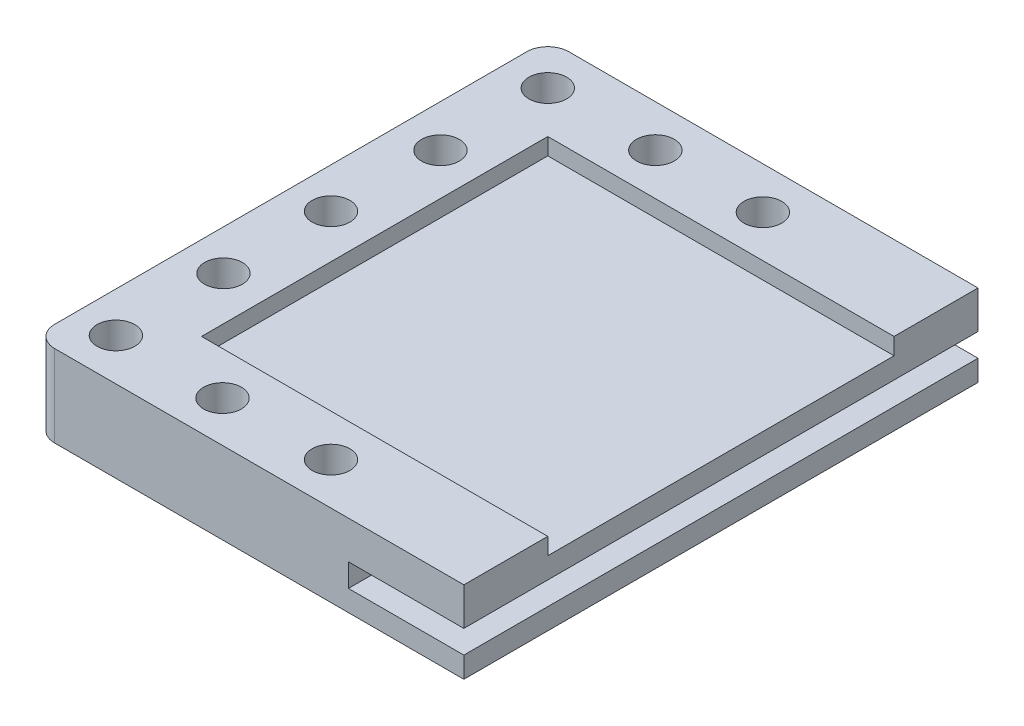
ISO-10303-21;
HEADER;
FILE_DESCRIPTION(('STEP AP214'),'2;1');
FILE_NAME('part.step','',(''),(''),'','','');
FILE_SCHEMA(('AUTOMOTIVE_DESIGN { 1 0 10303 214 1 1 1 1 }'));
ENDSEC;
DATA;
#1=APPLICATION_CONTEXT('core data for automotive mechanical design processes');
#2=APPLICATION_PROTOCOL_DEFINITION('international standard','automotive_design',2000,#1);
#3=PRODUCT_CONTEXT('',#1,'mechanical');
#4=PRODUCT('Part','Part','',(#3));
#5=PRODUCT_RELATED_PRODUCT_CATEGORY('part','',(#4));
#6=PRODUCT_DEFINITION_FORMATION('','',#4);
#7=PRODUCT_DEFINITION_CONTEXT('part definition',#1,'design');
#8=PRODUCT_DEFINITION('design','',#6,#7);
#9=PRODUCT_DEFINITION_SHAPE('','',#8);
#10=(LENGTH_UNIT() NAMED_UNIT(*) SI_UNIT(.MILLI.,.METRE.));
#11=(NAMED_UNIT(*) PLANE_ANGLE_UNIT() SI_UNIT($,.RADIAN.));
#12=(NAMED_UNIT(*) SI_UNIT($,.STERADIAN.) SOLID_ANGLE_UNIT());
#13=UNCERTAINTY_MEASURE_WITH_UNIT(LENGTH_MEASURE(1.E-05),#10,'distance_accuracy_value','');
#14=(GEOMETRIC_REPRESENTATION_CONTEXT(3) GLOBAL_UNCERTAINTY_ASSIGNED_CONTEXT((#13)) GLOBAL_UNIT_ASSIGNED_CONTEXT((#10,
#11,#12)) REPRESENTATION_CONTEXT('',''));
#15=CARTESIAN_POINT('',(0.,0.,0.));
#16=DIRECTION('',(0.,0.,1.));
#17=DIRECTION('',(1.,0.,0.));
#18=AXIS2_PLACEMENT_3D('',#15,#16,#17);
#19=CARTESIAN_POINT('',(5.81604538087521,1.,-10.0891410048622));
#20=DIRECTION('',(0.,-1.,0.));
#21=DIRECTION('',(1.,0.,0.));
#22=AXIS2_PLACEMENT_3D('',#19,#20,#21);
#23=PLANE('',#22);
#24=CARTESIAN_POINT('',(3.06604538087521,1.,-5.33914100486223));
#25=DIRECTION('',(0.,-1.,0.));
#26=DIRECTION('',(1.,0.,0.));
#27=AXIS2_PLACEMENT_3D('',#24,#25,#26);
#28=CIRCLE('',#27,1.125);
#29=CARTESIAN_POINT('',(4.19104538087521,1.,-5.33914100486223));
#30=VERTEX_POINT('',#29);
#31=EDGE_CURVE('E647',#30,#30,#28,.F.);
#32=ORIENTED_EDGE('',*,*,#31,.F.);
#33=EDGE_LOOP('',(#32));
#34=FACE_BOUND('',#33,.T.);
#35=CARTESIAN_POINT('',(3.06604538087521,1.,-0.339141004862235));
#36=DIRECTION('',(0.,-1.,0.));
#37=DIRECTION('',(1.,0.,0.));
#38=AXIS2_PLACEMENT_3D('',#35,#36,#37);
#39=CIRCLE('',#38,1.125);
#40=CARTESIAN_POINT('',(4.19104538087521,1.,-0.339141004862235));
#41=VERTEX_POINT('',#40);
#42=EDGE_CURVE('E653',#41,#41,#39,.F.);
#43=ORIENTED_EDGE('',*,*,#42,.F.);
#44=EDGE_LOOP('',(#43));
#45=FACE_BOUND('',#44,.T.);
#46=CARTESIAN_POINT('',(3.06604538087521,1.,4.66085899513777));
#47=DIRECTION('',(0.,-1.,0.));
#48=DIRECTION('',(1.,0.,0.));
#49=AXIS2_PLACEMENT_3D('',#46,#47,#48);
#50=CIRCLE('',#49,1.125);
#51=CARTESIAN_POINT('',(4.19104538087521,1.,4.66085899513777));
#52=VERTEX_POINT('',#51);
#53=EDGE_CURVE('E659',#52,#52,#50,.F.);
#54=ORIENTED_EDGE('',*,*,#53,.F.);
#55=EDGE_LOOP('',(#54));
#56=FACE_BOUND('',#55,.T.);
#57=DIRECTION('',(1.,0.,0.));
#58=VECTOR('',#57,1.);
#59=CARTESIAN_POINT('',(5.81604538087521,1.,14.4108589951378));
#60=LINE('',#59,#58);
#61=CARTESIAN_POINT('',(0.316045380875207,0.999999999999999,14.4108589951378));
#62=VERTEX_POINT('',#61);
#63=CARTESIAN_POINT('',(5.81604538087521,1.,14.4108589951378));
#64=VERTEX_POINT('',#63);
#65=EDGE_CURVE('E195',#62,#64,#60,.T.);
#66=ORIENTED_EDGE('',*,*,#65,.T.);
#67=DIRECTION('',(0.,0.,1.));
#68=VECTOR('',#67,1.);
#69=CARTESIAN_POINT('',(5.81604538087521,1.,-10.0891410048622));
#70=LINE('',#69,#68);
#71=CARTESIAN_POINT('',(5.81604538087521,1.,-10.0891410048622));
#72=VERTEX_POINT('',#71);
#73=EDGE_CURVE('E208',#72,#64,#70,.T.);
#74=ORIENTED_EDGE('',*,*,#73,.F.);
#75=DIRECTION('',(1.,0.,0.));
#76=VECTOR('',#75,1.);
#77=CARTESIAN_POINT('',(5.81604538087521,1.,-10.0891410048622));
#78=LINE('',#77,#76);
#79=CARTESIAN_POINT('',(0.316045380875207,0.999999999999999,-10.0891410048622));
#80=VERTEX_POINT('',#79);
#81=EDGE_CURVE('E198',#80,#72,#78,.T.);
#82=ORIENTED_EDGE('',*,*,#81,.F.);
#83=DIRECTION('',(0.,0.,1.));
#84=VECTOR('',#83,1.);
#85=CARTESIAN_POINT('',(0.316045380875207,0.999999999999999,-10.0891410048622));
#86=LINE('',#85,#84);
#87=EDGE_CURVE('E212',#80,#62,#86,.T.);
#88=ORIENTED_EDGE('',*,*,#87,.T.);
#89=EDGE_LOOP('',(#66,#74,#82,#88));
#90=FACE_BOUND('',#89,.T.);
#91=CARTESIAN_POINT('',(3.0468473189974,1.,9.66082213844394));
#92=DIRECTION('',(0.,-1.,0.));
#93=DIRECTION('',(1.,0.,0.));
#94=AXIS2_PLACEMENT_3D('',#91,#92,#93);
#95=CIRCLE('',#94,1.125);
#96=CARTESIAN_POINT('',(4.1718473189974,1.,9.66082213844394));
#97=VERTEX_POINT('',#96);
#98=EDGE_CURVE('E184',#97,#97,#95,.F.);
#99=ORIENTED_EDGE('',*,*,#98,.F.);
#100=EDGE_LOOP('',(#99));
#101=FACE_BOUND('',#100,.T.);
#102=ADVANCED_FACE('F35',(#34,#45,#56,#90,#101),#23,.F.);
#103=CARTESIAN_POINT('',(0.,3.1,0.));
#104=DIRECTION('',(0.,1.,0.));
#105=DIRECTION('',(0.,0.,1.));
#106=AXIS2_PLACEMENT_3D('',#103,#104,#105);
#107=PLANE('',#106);
#108=DIRECTION('',(0.,0.,1.));
#109=VECTOR('',#108,1.);
#110=CARTESIAN_POINT('',(-10.6839546191248,3.1,0.));
#111=LINE('',#110,#109);
#112=CARTESIAN_POINT('',(-10.6839546191248,3.1,-6.08914100486223));
#113=VERTEX_POINT('',#112);
#114=CARTESIAN_POINT('',(-10.6839546191248,3.1,10.4108589951378));
#115=VERTEX_POINT('',#114);
#116=EDGE_CURVE('E146',#113,#115,#111,.T.);
#117=ORIENTED_EDGE('',*,*,#116,.T.);
#118=DIRECTION('',(1.,0.,0.));
#119=VECTOR('',#118,1.);
#120=CARTESIAN_POINT('',(0.,3.1,10.4108589951378));
#121=LINE('',#120,#119);
#122=CARTESIAN_POINT('',(5.81604538087521,3.1,10.4108589951378));
#123=VERTEX_POINT('',#122);
#124=EDGE_CURVE('E164',#115,#123,#121,.T.);
#125=ORIENTED_EDGE('',*,*,#124,.T.);
#126=DIRECTION('',(0.,0.,-1.));
#127=VECTOR('',#126,1.);
#128=CARTESIAN_POINT('',(5.8160453808752,3.1,-10.0891410048622));
#129=LINE('',#128,#127);
#130=CARTESIAN_POINT('',(5.8160453808752,3.1,-6.08914100486223));
#131=VERTEX_POINT('',#130);
#132=EDGE_CURVE('E217',#123,#131,#129,.T.);
#133=ORIENTED_EDGE('',*,*,#132,.T.);
#134=DIRECTION('',(1.,0.,0.));
#135=VECTOR('',#134,1.);
#136=CARTESIAN_POINT('',(0.,3.1,-6.08914100486223));
#137=LINE('',#136,#135);
#138=EDGE_CURVE('E166',#113,#131,#137,.T.);
#139=ORIENTED_EDGE('',*,*,#138,.F.);
#140=EDGE_LOOP('',(#117,#125,#133,#139));
#141=FACE_BOUND('',#140,.T.);
#142=ADVANCED_FACE('F292',(#141),#107,.T.);
#143=CARTESIAN_POINT('',(5.8160453808752,3.1,-10.0891410048622));
#144=DIRECTION('',(-1.,0.,0.));
#145=DIRECTION('',(0.,0.,1.));
#146=AXIS2_PLACEMENT_3D('',#143,#144,#145);
#147=PLANE('',#146);
#148=DIRECTION('',(0.,-1.,0.));
#149=VECTOR('',#148,1.);
#150=CARTESIAN_POINT('',(5.8160453808752,3.1,-10.0891410048622));
#151=LINE('',#150,#149);
#152=CARTESIAN_POINT('',(5.8160453808752,0.,-10.0891410048622));
#153=VERTEX_POINT('',#152);
#154=EDGE_CURVE('E219',#72,#153,#151,.T.);
#155=ORIENTED_EDGE('',*,*,#154,.F.);
#156=ORIENTED_EDGE('',*,*,#73,.T.);
#157=DIRECTION('',(0.,-1.,0.));
#158=VECTOR('',#157,1.);
#159=CARTESIAN_POINT('',(5.81604538087521,3.1,14.4108589951378));
#160=LINE('',#159,#158);
#161=CARTESIAN_POINT('',(5.81604538087521,0.,14.4108589951378));
#162=VERTEX_POINT('',#161);
#163=EDGE_CURVE('E231',#64,#162,#160,.T.);
#164=ORIENTED_EDGE('',*,*,#163,.T.);
#165=DIRECTION('',(0.,0.,-1.));
#166=VECTOR('',#165,1.);
#167=CARTESIAN_POINT('',(5.8160453808752,0.,-10.0891410048622));
#168=LINE('',#167,#166);
#169=EDGE_CURVE('E224',#162,#153,#168,.T.);
#170=ORIENTED_EDGE('',*,*,#169,.T.);
#171=EDGE_LOOP('',(#155,#156,#164,#170));
#172=FACE_BOUND('',#171,.T.);
#173=ADVANCED_FACE('F272',(#172),#147,.F.);
#174=CARTESIAN_POINT('',(-14.6839546191248,3.1,-10.0891410048622));
#175=DIRECTION('',(1.,0.,0.));
#176=DIRECTION('',(0.,0.,-1.));
#177=AXIS2_PLACEMENT_3D('',#174,#175,#176);
#178=PLANE('',#177);
#179=DIRECTION('',(0.,0.,1.));
#180=VECTOR('',#179,1.);
#181=CARTESIAN_POINT('',(-14.6839546191248,0.,-10.0891410048622));
#182=LINE('',#181,#180);
#183=CARTESIAN_POINT('',(-14.6839546191248,0.,-9.08914100486224));
#184=VERTEX_POINT('',#183);
#185=CARTESIAN_POINT('',(-14.6839546191248,0.,13.4108589951378));
#186=VERTEX_POINT('',#185);
#187=EDGE_CURVE('E211',#184,#186,#182,.T.);
#188=ORIENTED_EDGE('',*,*,#187,.T.);
#189=DIRECTION('',(0.,-1.,0.));
#190=VECTOR('',#189,1.);
#191=CARTESIAN_POINT('',(-14.6839546191248,3.1,13.4108589951378));
#192=LINE('',#191,#190);
#193=CARTESIAN_POINT('',(-14.6839546191248,3.9,13.4108589951378));
#194=VERTEX_POINT('',#193);
#195=EDGE_CURVE('E56',#186,#194,#192,.F.);
#196=ORIENTED_EDGE('',*,*,#195,.T.);
#197=DIRECTION('',(0.,0.,1.));
#198=VECTOR('',#197,1.);
#199=CARTESIAN_POINT('',(-14.6839546191248,3.9,0.));
#200=LINE('',#199,#198);
#201=CARTESIAN_POINT('',(-14.6839546191248,3.9,-9.08914100486224));
#202=VERTEX_POINT('',#201);
#203=EDGE_CURVE('E175',#202,#194,#200,.T.);
#204=ORIENTED_EDGE('',*,*,#203,.F.);
#205=DIRECTION('',(0.,-1.,0.));
#206=VECTOR('',#205,1.);
#207=CARTESIAN_POINT('',(-14.6839546191248,3.1,-9.08914100486224));
#208=LINE('',#207,#206);
#209=EDGE_CURVE('E242',#202,#184,#208,.T.);
#210=ORIENTED_EDGE('',*,*,#209,.T.);
#211=EDGE_LOOP('',(#188,#196,#204,#210));
#212=FACE_BOUND('',#211,.T.);
#213=ADVANCED_FACE('F262',(#212),#178,.F.);
#214=CARTESIAN_POINT('',(-14.6839546191248,3.1,14.4108589951378));
#215=DIRECTION('',(0.,0.,-1.));
#216=DIRECTION('',(-1.,0.,0.));
#217=AXIS2_PLACEMENT_3D('',#214,#215,#216);
#218=PLANE('',#217);
#219=DIRECTION('',(1.,0.,0.));
#220=VECTOR('',#219,1.);
#221=CARTESIAN_POINT('',(0.,3.9,14.4108589951378));
#222=LINE('',#221,#220);
#223=CARTESIAN_POINT('',(-13.6839546191248,3.9,14.4108589951378));
#224=VERTEX_POINT('',#223);
#225=CARTESIAN_POINT('',(5.81604538087521,3.9,14.4108589951378));
#226=VERTEX_POINT('',#225);
#227=EDGE_CURVE('E177',#224,#226,#222,.T.);
#228=ORIENTED_EDGE('',*,*,#227,.F.);
#229=DIRECTION('',(0.,-1.,0.));
#230=VECTOR('',#229,1.);
#231=CARTESIAN_POINT('',(-13.6839546191248,3.1,14.4108589951378));
#232=LINE('',#231,#230);
#233=CARTESIAN_POINT('',(-13.6839546191248,0.,14.4108589951378));
#234=VERTEX_POINT('',#233);
#235=EDGE_CURVE('E235',#224,#234,#232,.T.);
#236=ORIENTED_EDGE('',*,*,#235,.T.);
#237=DIRECTION('',(1.,0.,0.));
#238=VECTOR('',#237,1.);
#239=CARTESIAN_POINT('',(-14.6839546191248,0.,14.4108589951378));
#240=LINE('',#239,#238);
#241=EDGE_CURVE('E222',#234,#162,#240,.T.);
#242=ORIENTED_EDGE('',*,*,#241,.T.);
#243=ORIENTED_EDGE('',*,*,#163,.F.);
#244=ORIENTED_EDGE('',*,*,#65,.F.);
#245=DIRECTION('',(0.,-1.,0.));
#246=VECTOR('',#245,1.);
#247=CARTESIAN_POINT('',(0.316045380875207,2.1,14.4108589951378));
#248=LINE('',#247,#246);
#249=CARTESIAN_POINT('',(0.316045380875207,2.1,14.4108589951378));
#250=VERTEX_POINT('',#249);
#251=EDGE_CURVE('E204',#250,#62,#248,.T.);
#252=ORIENTED_EDGE('',*,*,#251,.F.);
#253=DIRECTION('',(-1.,0.,0.));
#254=VECTOR('',#253,1.);
#255=CARTESIAN_POINT('',(5.81604538087521,2.1,14.4108589951378));
#256=LINE('',#255,#254);
#257=CARTESIAN_POINT('',(5.81604538087521,2.1,14.4108589951378));
#258=VERTEX_POINT('',#257);
#259=EDGE_CURVE('E149',#258,#250,#256,.T.);
#260=ORIENTED_EDGE('',*,*,#259,.F.);
#261=EDGE_CURVE('E232',#226,#258,#160,.T.);
#262=ORIENTED_EDGE('',*,*,#261,.F.);
#263=EDGE_LOOP('',(#228,#236,#242,#243,#244,#252,#260,#262));
#264=FACE_BOUND('',#263,.T.);
#265=ADVANCED_FACE('F253',(#264),#218,.F.);
#266=ORIENTED_EDGE('',*,*,#261,.T.);
#267=DIRECTION('',(0.,0.,1.));
#268=VECTOR('',#267,1.);
#269=CARTESIAN_POINT('',(5.81604538087521,2.1,-10.0891410048622));
#270=LINE('',#269,#268);
#271=CARTESIAN_POINT('',(5.81604538087521,2.1,-10.0891410048622));
#272=VERTEX_POINT('',#271);
#273=EDGE_CURVE('E201',#272,#258,#270,.T.);
#274=ORIENTED_EDGE('',*,*,#273,.F.);
#275=CARTESIAN_POINT('',(5.8160453808752,3.9,-10.0891410048622));
#276=VERTEX_POINT('',#275);
#277=EDGE_CURVE('E228',#276,#272,#151,.T.);
#278=ORIENTED_EDGE('',*,*,#277,.F.);
#279=DIRECTION('',(0.,0.,-1.));
#280=VECTOR('',#279,1.);
#281=CARTESIAN_POINT('',(5.81604538087521,3.9,0.));
#282=LINE('',#281,#280);
#283=CARTESIAN_POINT('',(5.8160453808752,3.9,-6.08914100486223));
#284=VERTEX_POINT('',#283);
#285=EDGE_CURVE('E159',#284,#276,#282,.T.);
#286=ORIENTED_EDGE('',*,*,#285,.F.);
#287=DIRECTION('',(0.,-1.,0.));
#288=VECTOR('',#287,1.);
#289=CARTESIAN_POINT('',(5.8160453808752,3.9,-6.08914100486223));
#290=LINE('',#289,#288);
#291=EDGE_CURVE('E150',#284,#131,#290,.T.);
#292=ORIENTED_EDGE('',*,*,#291,.T.);
#293=ORIENTED_EDGE('',*,*,#132,.F.);
#294=DIRECTION('',(0.,-1.,0.));
#295=VECTOR('',#294,1.);
#296=CARTESIAN_POINT('',(5.81604538087521,3.9,10.4108589951378));
#297=LINE('',#296,#295);
#298=CARTESIAN_POINT('',(5.81604538087521,3.9,10.4108589951378));
#299=VERTEX_POINT('',#298);
#300=EDGE_CURVE('E187',#299,#123,#297,.T.);
#301=ORIENTED_EDGE('',*,*,#300,.F.);
#302=DIRECTION('',(0.,0.,-1.));
#303=VECTOR('',#302,1.);
#304=CARTESIAN_POINT('',(5.81604538087521,3.9,0.));
#305=LINE('',#304,#303);
#306=EDGE_CURVE('E179',#226,#299,#305,.T.);
#307=ORIENTED_EDGE('',*,*,#306,.F.);
#308=EDGE_LOOP('',(#266,#274,#278,#286,#292,#293,#301,#307));
#309=FACE_BOUND('',#308,.T.);
#310=ADVANCED_FACE('F285',(#309),#147,.F.);
#311=CARTESIAN_POINT('',(-14.6839546191248,3.1,-10.0891410048622));
#312=DIRECTION('',(0.,0.,1.));
#313=DIRECTION('',(1.,0.,0.));
#314=AXIS2_PLACEMENT_3D('',#311,#312,#313);
#315=PLANE('',#314);
#316=DIRECTION('',(-1.,0.,0.));
#317=VECTOR('',#316,1.);
#318=CARTESIAN_POINT('',(-14.6839546191248,0.,-10.0891410048622));
#319=LINE('',#318,#317);
#320=CARTESIAN_POINT('',(-13.6839546191248,0.,-10.0891410048622));
#321=VERTEX_POINT('',#320);
#322=EDGE_CURVE('E220',#153,#321,#319,.T.);
#323=ORIENTED_EDGE('',*,*,#322,.T.);
#324=DIRECTION('',(0.,-1.,0.));
#325=VECTOR('',#324,1.);
#326=CARTESIAN_POINT('',(-13.6839546191248,3.1,-10.0891410048622));
#327=LINE('',#326,#325);
#328=CARTESIAN_POINT('',(-13.6839546191248,3.9,-10.0891410048622));
#329=VERTEX_POINT('',#328);
#330=EDGE_CURVE('E11',#321,#329,#327,.F.);
#331=ORIENTED_EDGE('',*,*,#330,.T.);
#332=DIRECTION('',(-1.,0.,0.));
#333=VECTOR('',#332,1.);
#334=CARTESIAN_POINT('',(0.,3.9,-10.0891410048622));
#335=LINE('',#334,#333);
#336=EDGE_CURVE('E173',#276,#329,#335,.T.);
#337=ORIENTED_EDGE('',*,*,#336,.F.);
#338=ORIENTED_EDGE('',*,*,#277,.T.);
#339=DIRECTION('',(-1.,0.,0.));
#340=VECTOR('',#339,1.);
#341=CARTESIAN_POINT('',(5.81604538087521,2.1,-10.0891410048622));
#342=LINE('',#341,#340);
#343=CARTESIAN_POINT('',(0.316045380875207,2.1,-10.0891410048622));
#344=VERTEX_POINT('',#343);
#345=EDGE_CURVE('E191',#272,#344,#342,.T.);
#346=ORIENTED_EDGE('',*,*,#345,.T.);
#347=DIRECTION('',(0.,-1.,0.));
#348=VECTOR('',#347,1.);
#349=CARTESIAN_POINT('',(0.316045380875207,2.1,-10.0891410048622));
#350=LINE('',#349,#348);
#351=EDGE_CURVE('E194',#344,#80,#350,.T.);
#352=ORIENTED_EDGE('',*,*,#351,.T.);
#353=ORIENTED_EDGE('',*,*,#81,.T.);
#354=ORIENTED_EDGE('',*,*,#154,.T.);
#355=EDGE_LOOP('',(#323,#331,#337,#338,#346,#352,#353,#354));
#356=FACE_BOUND('',#355,.T.);
#357=ADVANCED_FACE('F267',(#356),#315,.F.);
#358=CARTESIAN_POINT('',(0.,0.,0.));
#359=DIRECTION('',(0.,1.,0.));
#360=DIRECTION('',(0.,0.,1.));
#361=AXIS2_PLACEMENT_3D('',#358,#359,#360);
#362=PLANE('',#361);
#363=CARTESIAN_POINT('',(-12.6839546191248,0.,-8.08914100486223));
#364=DIRECTION('',(0.,1.,0.));
#365=DIRECTION('',(0.,0.,1.));
#366=AXIS2_PLACEMENT_3D('',#363,#364,#365);
#367=CIRCLE('',#366,0.9);
#368=CARTESIAN_POINT('',(-12.6839546191248,0.,-7.18914100486224));
#369=VERTEX_POINT('',#368);
#370=EDGE_CURVE('E708',#369,#369,#367,.T.);
#371=ORIENTED_EDGE('',*,*,#370,.T.);
#372=EDGE_LOOP('',(#371));
#373=FACE_BOUND('',#372,.T.);
#374=CARTESIAN_POINT('',(-12.6745256875154,0.,-2.96414100486223));
#375=DIRECTION('',(0.,1.,0.));
#376=DIRECTION('',(0.,0.,1.));
#377=AXIS2_PLACEMENT_3D('',#374,#375,#376);
#378=CIRCLE('',#377,0.9);
#379=CARTESIAN_POINT('',(-12.6745256875154,0.,-2.06414100486223));
#380=VERTEX_POINT('',#379);
#381=EDGE_CURVE('E704',#380,#380,#378,.T.);
#382=ORIENTED_EDGE('',*,*,#381,.T.);
#383=EDGE_LOOP('',(#382));
#384=FACE_BOUND('',#383,.T.);
#385=CARTESIAN_POINT('',(-12.7647059813043,0.,2.16085899513777));
#386=DIRECTION('',(0.,1.,0.));
#387=DIRECTION('',(0.,0.,1.));
#388=AXIS2_PLACEMENT_3D('',#385,#386,#387);
#389=CIRCLE('',#388,0.9);
#390=CARTESIAN_POINT('',(-12.7647059813043,0.,3.06085899513777));
#391=VERTEX_POINT('',#390);
#392=EDGE_CURVE('E700',#391,#391,#389,.T.);
#393=ORIENTED_EDGE('',*,*,#392,.T.);
#394=EDGE_LOOP('',(#393));
#395=FACE_BOUND('',#394,.T.);
#396=CARTESIAN_POINT('',(-12.7647059813043,0.,7.28585899513777));
#397=DIRECTION('',(0.,1.,0.));
#398=DIRECTION('',(0.,0.,1.));
#399=AXIS2_PLACEMENT_3D('',#396,#397,#398);
#400=CIRCLE('',#399,0.9);
#401=CARTESIAN_POINT('',(-12.7647059813043,0.,8.18585899513776));
#402=VERTEX_POINT('',#401);
#403=EDGE_CURVE('E696',#402,#402,#400,.T.);
#404=ORIENTED_EDGE('',*,*,#403,.T.);
#405=EDGE_LOOP('',(#404));
#406=FACE_BOUND('',#405,.T.);
#407=CARTESIAN_POINT('',(-12.7647059813043,0.,12.4108589951378));
#408=DIRECTION('',(0.,1.,0.));
#409=DIRECTION('',(0.,0.,1.));
#410=AXIS2_PLACEMENT_3D('',#407,#408,#409);
#411=CIRCLE('',#410,0.9);
#412=CARTESIAN_POINT('',(-12.7647059813043,0.,13.3108589951378));
#413=VERTEX_POINT('',#412);
#414=EDGE_CURVE('E692',#413,#413,#411,.T.);
#415=ORIENTED_EDGE('',*,*,#414,.T.);
#416=EDGE_LOOP('',(#415));
#417=FACE_BOUND('',#416,.T.);
#418=CARTESIAN_POINT('',(-7.5589546191248,0.,-8.08914100486223));
#419=DIRECTION('',(0.,1.,0.));
#420=DIRECTION('',(0.,0.,1.));
#421=AXIS2_PLACEMENT_3D('',#418,#419,#420);
#422=CIRCLE('',#421,0.899999999999999);
#423=CARTESIAN_POINT('',(-7.5589546191248,0.,-7.18914100486224));
#424=VERTEX_POINT('',#423);
#425=EDGE_CURVE('E688',#424,#424,#422,.T.);
#426=ORIENTED_EDGE('',*,*,#425,.T.);
#427=EDGE_LOOP('',(#426));
#428=FACE_BOUND('',#427,.T.);
#429=CARTESIAN_POINT('',(-2.4339546191248,0.,-8.08914100486223));
#430=DIRECTION('',(0.,1.,0.));
#431=DIRECTION('',(0.,0.,1.));
#432=AXIS2_PLACEMENT_3D('',#429,#430,#431);
#433=CIRCLE('',#432,0.899999999999999);
#434=CARTESIAN_POINT('',(-2.4339546191248,0.,-7.18914100486224));
#435=VERTEX_POINT('',#434);
#436=EDGE_CURVE('E684',#435,#435,#433,.T.);
#437=ORIENTED_EDGE('',*,*,#436,.T.);
#438=EDGE_LOOP('',(#437));
#439=FACE_BOUND('',#438,.T.);
#440=CARTESIAN_POINT('',(-2.51470598130426,0.,12.4108589951378));
#441=DIRECTION('',(0.,1.,0.));
#442=DIRECTION('',(0.,0.,1.));
#443=AXIS2_PLACEMENT_3D('',#440,#441,#442);
#444=CIRCLE('',#443,0.899999999999999);
#445=CARTESIAN_POINT('',(-2.51470598130426,0.,13.3108589951378));
#446=VERTEX_POINT('',#445);
#447=EDGE_CURVE('E638',#446,#446,#444,.T.);
#448=ORIENTED_EDGE('',*,*,#447,.T.);
#449=EDGE_LOOP('',(#448));
#450=FACE_BOUND('',#449,.T.);
#451=CARTESIAN_POINT('',(-7.63970598130426,0.,12.4567229120628));
#452=DIRECTION('',(0.,1.,0.));
#453=DIRECTION('',(0.,0.,1.));
#454=AXIS2_PLACEMENT_3D('',#451,#452,#453);
#455=CIRCLE('',#454,0.899999999999999);
#456=CARTESIAN_POINT('',(-7.63970598130426,0.,13.3567229120628));
#457=VERTEX_POINT('',#456);
#458=EDGE_CURVE('E637',#457,#457,#455,.T.);
#459=ORIENTED_EDGE('',*,*,#458,.T.);
#460=EDGE_LOOP('',(#459));
#461=FACE_BOUND('',#460,.T.);
#462=CARTESIAN_POINT('',(3.06604538087521,0.,-5.33914100486223));
#463=DIRECTION('',(0.,-1.,0.));
#464=DIRECTION('',(0.,0.,-1.));
#465=AXIS2_PLACEMENT_3D('',#462,#463,#464);
#466=CIRCLE('',#465,1.125);
#467=CARTESIAN_POINT('',(3.06604538087521,0.,-6.46414100486224));
#468=VERTEX_POINT('',#467);
#469=EDGE_CURVE('E641',#468,#468,#466,.T.);
#470=ORIENTED_EDGE('',*,*,#469,.F.);
#471=EDGE_LOOP('',(#470));
#472=FACE_BOUND('',#471,.T.);
#473=CARTESIAN_POINT('',(3.06604538087521,0.,-0.339141004862235));
#474=DIRECTION('',(0.,-1.,0.));
#475=DIRECTION('',(0.,0.,-1.));
#476=AXIS2_PLACEMENT_3D('',#473,#474,#475);
#477=CIRCLE('',#476,1.125);
#478=CARTESIAN_POINT('',(3.06604538087521,0.,-1.46414100486224));
#479=VERTEX_POINT('',#478);
#480=EDGE_CURVE('E650',#479,#479,#477,.T.);
#481=ORIENTED_EDGE('',*,*,#480,.F.);
#482=EDGE_LOOP('',(#481));
#483=FACE_BOUND('',#482,.T.);
#484=CARTESIAN_POINT('',(3.06604538087521,0.,4.66085899513777));
#485=DIRECTION('',(0.,-1.,0.));
#486=DIRECTION('',(0.,0.,-1.));
#487=AXIS2_PLACEMENT_3D('',#484,#485,#486);
#488=CIRCLE('',#487,1.125);
#489=CARTESIAN_POINT('',(3.06604538087521,0.,3.53585899513776));
#490=VERTEX_POINT('',#489);
#491=EDGE_CURVE('E656',#490,#490,#488,.T.);
#492=ORIENTED_EDGE('',*,*,#491,.F.);
#493=EDGE_LOOP('',(#492));
#494=FACE_BOUND('',#493,.T.);
#495=CARTESIAN_POINT('',(3.0468473189974,0.,9.66082213844394));
#496=DIRECTION('',(0.,-1.,0.));
#497=DIRECTION('',(0.,0.,-1.));
#498=AXIS2_PLACEMENT_3D('',#495,#496,#497);
#499=CIRCLE('',#498,1.125);
#500=CARTESIAN_POINT('',(3.0468473189974,0.,8.53582213844394));
#501=VERTEX_POINT('',#500);
#502=EDGE_CURVE('E169',#501,#501,#499,.T.);
#503=ORIENTED_EDGE('',*,*,#502,.F.);
#504=EDGE_LOOP('',(#503));
#505=FACE_BOUND('',#504,.T.);
#506=ORIENTED_EDGE('',*,*,#241,.F.);
#507=CARTESIAN_POINT('',(-13.6839546191248,0.,13.4108589951378));
#508=DIRECTION('',(0.,1.,0.));
#509=DIRECTION('',(0.,0.,1.));
#510=AXIS2_PLACEMENT_3D('',#507,#508,#509);
#511=CIRCLE('',#510,1.);
#512=EDGE_CURVE('E240',#234,#186,#511,.F.);
#513=ORIENTED_EDGE('',*,*,#512,.T.);
#514=ORIENTED_EDGE('',*,*,#187,.F.);
#515=CARTESIAN_POINT('',(-13.6839546191248,0.,-9.08914100486224));
#516=DIRECTION('',(0.,1.,0.));
#517=DIRECTION('',(0.,0.,1.));
#518=AXIS2_PLACEMENT_3D('',#515,#516,#517);
#519=CIRCLE('',#518,1.);
#520=EDGE_CURVE('E238',#184,#321,#519,.F.);
#521=ORIENTED_EDGE('',*,*,#520,.T.);
#522=ORIENTED_EDGE('',*,*,#322,.F.);
#523=ORIENTED_EDGE('',*,*,#169,.F.);
#524=EDGE_LOOP('',(#506,#513,#514,#521,#522,#523));
#525=FACE_BOUND('',#524,.T.);
#526=ADVANCED_FACE('F260',(#373,#384,#395,#406,#417,#428,#439,#450,#461,#472,#483,#494,#505,
#525),#362,.F.);
#527=CARTESIAN_POINT('',(0.316045380875207,2.1,-10.0891410048622));
#528=DIRECTION('',(-1.,0.,0.));
#529=DIRECTION('',(0.,-1.,0.));
#530=AXIS2_PLACEMENT_3D('',#527,#528,#529);
#531=PLANE('',#530);
#532=ORIENTED_EDGE('',*,*,#251,.T.);
#533=ORIENTED_EDGE('',*,*,#87,.F.);
#534=ORIENTED_EDGE('',*,*,#351,.F.);
#535=DIRECTION('',(0.,0.,1.));
#536=VECTOR('',#535,1.);
#537=CARTESIAN_POINT('',(0.316045380875207,2.1,-10.0891410048622));
#538=LINE('',#537,#536);
#539=EDGE_CURVE('E214',#344,#250,#538,.T.);
#540=ORIENTED_EDGE('',*,*,#539,.T.);
#541=EDGE_LOOP('',(#532,#533,#534,#540));
#542=FACE_BOUND('',#541,.T.);
#543=ADVANCED_FACE('F279',(#542),#531,.F.);
#544=CARTESIAN_POINT('',(5.81604538087521,2.1,-10.0891410048622));
#545=DIRECTION('',(0.,1.,0.));
#546=DIRECTION('',(-1.,0.,0.));
#547=AXIS2_PLACEMENT_3D('',#544,#545,#546);
#548=PLANE('',#547);
#549=ORIENTED_EDGE('',*,*,#259,.T.);
#550=ORIENTED_EDGE('',*,*,#539,.F.);
#551=ORIENTED_EDGE('',*,*,#345,.F.);
#552=ORIENTED_EDGE('',*,*,#273,.T.);
#553=EDGE_LOOP('',(#549,#550,#551,#552));
#554=FACE_BOUND('',#553,.T.);
#555=ADVANCED_FACE('F282',(#554),#548,.F.);
#556=CARTESIAN_POINT('',(-10.6839546191248,3.9,0.));
#557=DIRECTION('',(1.,0.,0.));
#558=DIRECTION('',(0.,0.,-1.));
#559=AXIS2_PLACEMENT_3D('',#556,#557,#558);
#560=PLANE('',#559);
#561=ORIENTED_EDGE('',*,*,#116,.F.);
#562=DIRECTION('',(0.,-1.,0.));
#563=VECTOR('',#562,1.);
#564=CARTESIAN_POINT('',(-10.6839546191248,3.9,-6.08914100486223));
#565=LINE('',#564,#563);
#566=CARTESIAN_POINT('',(-10.6839546191248,3.9,-6.08914100486223));
#567=VERTEX_POINT('',#566);
#568=EDGE_CURVE('E139',#567,#113,#565,.T.);
#569=ORIENTED_EDGE('',*,*,#568,.F.);
#570=DIRECTION('',(0.,0.,1.));
#571=VECTOR('',#570,1.);
#572=CARTESIAN_POINT('',(-10.6839546191248,3.9,0.));
#573=LINE('',#572,#571);
#574=CARTESIAN_POINT('',(-10.6839546191248,3.9,10.4108589951378));
#575=VERTEX_POINT('',#574);
#576=EDGE_CURVE('E144',#567,#575,#573,.T.);
#577=ORIENTED_EDGE('',*,*,#576,.T.);
#578=DIRECTION('',(0.,-1.,0.));
#579=VECTOR('',#578,1.);
#580=CARTESIAN_POINT('',(-10.6839546191248,3.9,10.4108589951378));
#581=LINE('',#580,#579);
#582=EDGE_CURVE('E182',#575,#115,#581,.T.);
#583=ORIENTED_EDGE('',*,*,#582,.T.);
#584=EDGE_LOOP('',(#561,#569,#577,#583));
#585=FACE_BOUND('',#584,.T.);
#586=ADVANCED_FACE('F141',(#585),#560,.T.);
#587=CARTESIAN_POINT('',(0.,3.9,-6.08914100486223));
#588=DIRECTION('',(0.,0.,-1.));
#589=DIRECTION('',(-1.,0.,0.));
#590=AXIS2_PLACEMENT_3D('',#587,#588,#589);
#591=PLANE('',#590);
#592=ORIENTED_EDGE('',*,*,#138,.T.);
#593=ORIENTED_EDGE('',*,*,#291,.F.);
#594=DIRECTION('',(1.,0.,0.));
#595=VECTOR('',#594,1.);
#596=CARTESIAN_POINT('',(0.,3.9,-6.08914100486223));
#597=LINE('',#596,#595);
#598=EDGE_CURVE('E153',#567,#284,#597,.T.);
#599=ORIENTED_EDGE('',*,*,#598,.F.);
#600=ORIENTED_EDGE('',*,*,#568,.T.);
#601=EDGE_LOOP('',(#592,#593,#599,#600));
#602=FACE_BOUND('',#601,.T.);
#603=ADVANCED_FACE('F154',(#602),#591,.F.);
#604=CARTESIAN_POINT('',(0.,3.9,10.4108589951378));
#605=DIRECTION('',(0.,0.,-1.));
#606=DIRECTION('',(-1.,0.,0.));
#607=AXIS2_PLACEMENT_3D('',#604,#605,#606);
#608=PLANE('',#607);
#609=ORIENTED_EDGE('',*,*,#124,.F.);
#610=ORIENTED_EDGE('',*,*,#582,.F.);
#611=DIRECTION('',(1.,0.,0.));
#612=VECTOR('',#611,1.);
#613=CARTESIAN_POINT('',(0.,3.9,10.4108589951378));
#614=LINE('',#613,#612);
#615=EDGE_CURVE('E163',#575,#299,#614,.T.);
#616=ORIENTED_EDGE('',*,*,#615,.T.);
#617=ORIENTED_EDGE('',*,*,#300,.T.);
#618=EDGE_LOOP('',(#609,#610,#616,#617));
#619=FACE_BOUND('',#618,.T.);
#620=ADVANCED_FACE('F290',(#619),#608,.T.);
#621=CARTESIAN_POINT('',(0.,3.9,0.));
#622=DIRECTION('',(0.,1.,0.));
#623=DIRECTION('',(0.,0.,1.));
#624=AXIS2_PLACEMENT_3D('',#621,#622,#623);
#625=PLANE('',#624);
#626=CARTESIAN_POINT('',(-12.6839546191248,3.9,-8.08914100486223));
#627=DIRECTION('',(0.,1.,0.));
#628=DIRECTION('',(0.,0.,1.));
#629=AXIS2_PLACEMENT_3D('',#626,#627,#628);
#630=CIRCLE('',#629,0.9);
#631=CARTESIAN_POINT('',(-12.6839546191248,3.9,-7.18914100486224));
#632=VERTEX_POINT('',#631);
#633=EDGE_CURVE('E604',#632,#632,#630,.T.);
#634=ORIENTED_EDGE('',*,*,#633,.F.);
#635=EDGE_LOOP('',(#634));
#636=FACE_BOUND('',#635,.T.);
#637=CARTESIAN_POINT('',(-12.6745256875154,3.9,-2.96414100486223));
#638=DIRECTION('',(0.,1.,0.));
#639=DIRECTION('',(0.,0.,1.));
#640=AXIS2_PLACEMENT_3D('',#637,#638,#639);
#641=CIRCLE('',#640,0.9);
#642=CARTESIAN_POINT('',(-12.6745256875154,3.9,-2.06414100486223));
#643=VERTEX_POINT('',#642);
#644=EDGE_CURVE('E608',#643,#643,#641,.T.);
#645=ORIENTED_EDGE('',*,*,#644,.F.);
#646=EDGE_LOOP('',(#645));
#647=FACE_BOUND('',#646,.T.);
#648=CARTESIAN_POINT('',(-12.7647059813043,3.9,2.16085899513777));
#649=DIRECTION('',(0.,1.,0.));
#650=DIRECTION('',(0.,0.,1.));
#651=AXIS2_PLACEMENT_3D('',#648,#649,#650);
#652=CIRCLE('',#651,0.9);
#653=CARTESIAN_POINT('',(-12.7647059813043,3.9,3.06085899513777));
#654=VERTEX_POINT('',#653);
#655=EDGE_CURVE('E612',#654,#654,#652,.T.);
#656=ORIENTED_EDGE('',*,*,#655,.F.);
#657=EDGE_LOOP('',(#656));
#658=FACE_BOUND('',#657,.T.);
#659=CARTESIAN_POINT('',(-12.7647059813043,3.9,7.28585899513777));
#660=DIRECTION('',(0.,1.,0.));
#661=DIRECTION('',(0.,0.,1.));
#662=AXIS2_PLACEMENT_3D('',#659,#660,#661);
#663=CIRCLE('',#662,0.9);
#664=CARTESIAN_POINT('',(-12.7647059813043,3.9,8.18585899513776));
#665=VERTEX_POINT('',#664);
#666=EDGE_CURVE('E616',#665,#665,#663,.T.);
#667=ORIENTED_EDGE('',*,*,#666,.F.);
#668=EDGE_LOOP('',(#667));
#669=FACE_BOUND('',#668,.T.);
#670=CARTESIAN_POINT('',(-12.7647059813043,3.9,12.4108589951378));
#671=DIRECTION('',(0.,1.,0.));
#672=DIRECTION('',(0.,0.,1.));
#673=AXIS2_PLACEMENT_3D('',#670,#671,#672);
#674=CIRCLE('',#673,0.9);
#675=CARTESIAN_POINT('',(-12.7647059813043,3.9,13.3108589951378));
#676=VERTEX_POINT('',#675);
#677=EDGE_CURVE('E620',#676,#676,#674,.T.);
#678=ORIENTED_EDGE('',*,*,#677,.F.);
#679=EDGE_LOOP('',(#678));
#680=FACE_BOUND('',#679,.T.);
#681=CARTESIAN_POINT('',(-7.5589546191248,3.9,-8.08914100486223));
#682=DIRECTION('',(0.,1.,0.));
#683=DIRECTION('',(0.,0.,1.));
#684=AXIS2_PLACEMENT_3D('',#681,#682,#683);
#685=CIRCLE('',#684,0.9);
#686=CARTESIAN_POINT('',(-7.5589546191248,3.9,-7.18914100486224));
#687=VERTEX_POINT('',#686);
#688=EDGE_CURVE('E624',#687,#687,#685,.T.);
#689=ORIENTED_EDGE('',*,*,#688,.F.);
#690=EDGE_LOOP('',(#689));
#691=FACE_BOUND('',#690,.T.);
#692=CARTESIAN_POINT('',(-2.4339546191248,3.9,-8.08914100486223));
#693=DIRECTION('',(0.,1.,0.));
#694=DIRECTION('',(0.,0.,1.));
#695=AXIS2_PLACEMENT_3D('',#692,#693,#694);
#696=CIRCLE('',#695,0.9);
#697=CARTESIAN_POINT('',(-2.4339546191248,3.9,-7.18914100486224));
#698=VERTEX_POINT('',#697);
#699=EDGE_CURVE('E628',#698,#698,#696,.T.);
#700=ORIENTED_EDGE('',*,*,#699,.F.);
#701=EDGE_LOOP('',(#700));
#702=FACE_BOUND('',#701,.T.);
#703=CARTESIAN_POINT('',(-2.51470598130426,3.9,12.4108589951378));
#704=DIRECTION('',(0.,1.,0.));
#705=DIRECTION('',(0.,0.,1.));
#706=AXIS2_PLACEMENT_3D('',#703,#704,#705);
#707=CIRCLE('',#706,0.9);
#708=CARTESIAN_POINT('',(-2.51470598130426,3.9,13.3108589951378));
#709=VERTEX_POINT('',#708);
#710=EDGE_CURVE('E632',#709,#709,#707,.T.);
#711=ORIENTED_EDGE('',*,*,#710,.F.);
#712=EDGE_LOOP('',(#711));
#713=FACE_BOUND('',#712,.T.);
#714=CARTESIAN_POINT('',(-7.63970598130426,3.9,12.4567229120628));
#715=DIRECTION('',(0.,1.,0.));
#716=DIRECTION('',(0.,0.,1.));
#717=AXIS2_PLACEMENT_3D('',#714,#715,#716);
#718=CIRCLE('',#717,0.9);
#719=CARTESIAN_POINT('',(-7.63970598130426,3.9,13.3567229120628));
#720=VERTEX_POINT('',#719);
#721=EDGE_CURVE('E635',#720,#720,#718,.T.);
#722=ORIENTED_EDGE('',*,*,#721,.F.);
#723=EDGE_LOOP('',(#722));
#724=FACE_BOUND('',#723,.T.);
#725=ORIENTED_EDGE('',*,*,#203,.T.);
#726=CARTESIAN_POINT('',(-13.6839546191248,3.9,13.4108589951378));
#727=DIRECTION('',(0.,1.,0.));
#728=DIRECTION('',(0.,0.,1.));
#729=AXIS2_PLACEMENT_3D('',#726,#727,#728);
#730=CIRCLE('',#729,1.);
#731=EDGE_CURVE('E43',#194,#224,#730,.T.);
#732=ORIENTED_EDGE('',*,*,#731,.T.);
#733=ORIENTED_EDGE('',*,*,#227,.T.);
#734=ORIENTED_EDGE('',*,*,#306,.T.);
#735=ORIENTED_EDGE('',*,*,#615,.F.);
#736=ORIENTED_EDGE('',*,*,#576,.F.);
#737=ORIENTED_EDGE('',*,*,#598,.T.);
#738=ORIENTED_EDGE('',*,*,#285,.T.);
#739=ORIENTED_EDGE('',*,*,#336,.T.);
#740=CARTESIAN_POINT('',(-13.6839546191248,3.9,-9.08914100486224));
#741=DIRECTION('',(0.,1.,0.));
#742=DIRECTION('',(0.,0.,1.));
#743=AXIS2_PLACEMENT_3D('',#740,#741,#742);
#744=CIRCLE('',#743,1.);
#745=EDGE_CURVE('E246',#329,#202,#744,.T.);
#746=ORIENTED_EDGE('',*,*,#745,.T.);
#747=EDGE_LOOP('',(#725,#732,#733,#734,#735,#736,#737,#738,#739,#746));
#748=FACE_BOUND('',#747,.T.);
#749=ADVANCED_FACE('F161',(#636,#647,#658,#669,#680,#691,#702,#713,#724,#748),#625,.T.);
#750=CARTESIAN_POINT('',(3.0468473189974,0.,9.66082213844394));
#751=DIRECTION('',(0.,-1.,0.));
#752=DIRECTION('',(0.,0.,-1.));
#753=AXIS2_PLACEMENT_3D('',#750,#751,#752);
#754=CYLINDRICAL_SURFACE('',#753,1.125);
#755=ORIENTED_EDGE('',*,*,#98,.T.);
#756=EDGE_LOOP('',(#755));
#757=FACE_BOUND('',#756,.T.);
#758=ORIENTED_EDGE('',*,*,#502,.T.);
#759=EDGE_LOOP('',(#758));
#760=FACE_BOUND('',#759,.T.);
#761=ADVANCED_FACE('F370',(#757,#760),#754,.F.);
#762=CARTESIAN_POINT('',(3.06604538087521,0.,4.66085899513777));
#763=DIRECTION('',(0.,-1.,0.));
#764=DIRECTION('',(0.,0.,-1.));
#765=AXIS2_PLACEMENT_3D('',#762,#763,#764);
#766=CYLINDRICAL_SURFACE('',#765,1.125);
#767=ORIENTED_EDGE('',*,*,#53,.T.);
#768=EDGE_LOOP('',(#767));
#769=FACE_BOUND('',#768,.T.);
#770=ORIENTED_EDGE('',*,*,#491,.T.);
#771=EDGE_LOOP('',(#770));
#772=FACE_BOUND('',#771,.T.);
#773=ADVANCED_FACE('F366',(#769,#772),#766,.F.);
#774=CARTESIAN_POINT('',(3.06604538087521,0.,-0.339141004862235));
#775=DIRECTION('',(0.,-1.,0.));
#776=DIRECTION('',(0.,0.,-1.));
#777=AXIS2_PLACEMENT_3D('',#774,#775,#776);
#778=CYLINDRICAL_SURFACE('',#777,1.125);
#779=ORIENTED_EDGE('',*,*,#42,.T.);
#780=EDGE_LOOP('',(#779));
#781=FACE_BOUND('',#780,.T.);
#782=ORIENTED_EDGE('',*,*,#480,.T.);
#783=EDGE_LOOP('',(#782));
#784=FACE_BOUND('',#783,.T.);
#785=ADVANCED_FACE('F362',(#781,#784),#778,.F.);
#786=CARTESIAN_POINT('',(3.06604538087521,0.,-5.33914100486223));
#787=DIRECTION('',(0.,-1.,0.));
#788=DIRECTION('',(0.,0.,-1.));
#789=AXIS2_PLACEMENT_3D('',#786,#787,#788);
#790=CYLINDRICAL_SURFACE('',#789,1.125);
#791=ORIENTED_EDGE('',*,*,#31,.T.);
#792=EDGE_LOOP('',(#791));
#793=FACE_BOUND('',#792,.T.);
#794=ORIENTED_EDGE('',*,*,#469,.T.);
#795=EDGE_LOOP('',(#794));
#796=FACE_BOUND('',#795,.T.);
#797=ADVANCED_FACE('F358',(#793,#796),#790,.F.);
#798=CARTESIAN_POINT('',(-7.63970598130426,3.9,12.4567229120628));
#799=DIRECTION('',(0.,1.,0.));
#800=DIRECTION('',(0.,0.,1.));
#801=AXIS2_PLACEMENT_3D('',#798,#799,#800);
#802=CYLINDRICAL_SURFACE('',#801,0.899999999999999);
#803=ORIENTED_EDGE('',*,*,#458,.F.);
#804=EDGE_LOOP('',(#803));
#805=FACE_BOUND('',#804,.T.);
#806=ORIENTED_EDGE('',*,*,#721,.T.);
#807=EDGE_LOOP('',(#806));
#808=FACE_BOUND('',#807,.T.);
#809=ADVANCED_FACE('F354',(#805,#808),#802,.F.);
#810=CARTESIAN_POINT('',(-2.51470598130426,3.9,12.4108589951378));
#811=DIRECTION('',(0.,1.,0.));
#812=DIRECTION('',(0.,0.,1.));
#813=AXIS2_PLACEMENT_3D('',#810,#811,#812);
#814=CYLINDRICAL_SURFACE('',#813,0.899999999999999);
#815=ORIENTED_EDGE('',*,*,#447,.F.);
#816=EDGE_LOOP('',(#815));
#817=FACE_BOUND('',#816,.T.);
#818=ORIENTED_EDGE('',*,*,#710,.T.);
#819=EDGE_LOOP('',(#818));
#820=FACE_BOUND('',#819,.T.);
#821=ADVANCED_FACE('F350',(#817,#820),#814,.F.);
#822=CARTESIAN_POINT('',(-2.4339546191248,3.9,-8.08914100486223));
#823=DIRECTION('',(0.,1.,0.));
#824=DIRECTION('',(0.,0.,1.));
#825=AXIS2_PLACEMENT_3D('',#822,#823,#824);
#826=CYLINDRICAL_SURFACE('',#825,0.899999999999999);
#827=ORIENTED_EDGE('',*,*,#436,.F.);
#828=EDGE_LOOP('',(#827));
#829=FACE_BOUND('',#828,.T.);
#830=ORIENTED_EDGE('',*,*,#699,.T.);
#831=EDGE_LOOP('',(#830));
#832=FACE_BOUND('',#831,.T.);
#833=ADVANCED_FACE('F346',(#829,#832),#826,.F.);
#834=CARTESIAN_POINT('',(-7.5589546191248,3.9,-8.08914100486223));
#835=DIRECTION('',(0.,1.,0.));
#836=DIRECTION('',(0.,0.,1.));
#837=AXIS2_PLACEMENT_3D('',#834,#835,#836);
#838=CYLINDRICAL_SURFACE('',#837,0.899999999999999);
#839=ORIENTED_EDGE('',*,*,#425,.F.);
#840=EDGE_LOOP('',(#839));
#841=FACE_BOUND('',#840,.T.);
#842=ORIENTED_EDGE('',*,*,#688,.T.);
#843=EDGE_LOOP('',(#842));
#844=FACE_BOUND('',#843,.T.);
#845=ADVANCED_FACE('F342',(#841,#844),#838,.F.);
#846=CARTESIAN_POINT('',(-12.7647059813043,3.9,12.4108589951378));
#847=DIRECTION('',(0.,1.,0.));
#848=DIRECTION('',(0.,0.,1.));
#849=AXIS2_PLACEMENT_3D('',#846,#847,#848);
#850=CYLINDRICAL_SURFACE('',#849,0.9);
#851=ORIENTED_EDGE('',*,*,#414,.F.);
#852=EDGE_LOOP('',(#851));
#853=FACE_BOUND('',#852,.T.);
#854=ORIENTED_EDGE('',*,*,#677,.T.);
#855=EDGE_LOOP('',(#854));
#856=FACE_BOUND('',#855,.T.);
#857=ADVANCED_FACE('F338',(#853,#856),#850,.F.);
#858=CARTESIAN_POINT('',(-12.7647059813043,3.9,7.28585899513777));
#859=DIRECTION('',(0.,1.,0.));
#860=DIRECTION('',(0.,0.,1.));
#861=AXIS2_PLACEMENT_3D('',#858,#859,#860);
#862=CYLINDRICAL_SURFACE('',#861,0.9);
#863=ORIENTED_EDGE('',*,*,#403,.F.);
#864=EDGE_LOOP('',(#863));
#865=FACE_BOUND('',#864,.T.);
#866=ORIENTED_EDGE('',*,*,#666,.T.);
#867=EDGE_LOOP('',(#866));
#868=FACE_BOUND('',#867,.T.);
#869=ADVANCED_FACE('F334',(#865,#868),#862,.F.);
#870=CARTESIAN_POINT('',(-12.7647059813043,3.9,2.16085899513777));
#871=DIRECTION('',(0.,1.,0.));
#872=DIRECTION('',(0.,0.,1.));
#873=AXIS2_PLACEMENT_3D('',#870,#871,#872);
#874=CYLINDRICAL_SURFACE('',#873,0.9);
#875=ORIENTED_EDGE('',*,*,#392,.F.);
#876=EDGE_LOOP('',(#875));
#877=FACE_BOUND('',#876,.T.);
#878=ORIENTED_EDGE('',*,*,#655,.T.);
#879=EDGE_LOOP('',(#878));
#880=FACE_BOUND('',#879,.T.);
#881=ADVANCED_FACE('F326',(#877,#880),#874,.F.);
#882=CARTESIAN_POINT('',(-12.6745256875154,3.9,-2.96414100486223));
#883=DIRECTION('',(0.,1.,0.));
#884=DIRECTION('',(0.,0.,1.));
#885=AXIS2_PLACEMENT_3D('',#882,#883,#884);
#886=CYLINDRICAL_SURFACE('',#885,0.9);
#887=ORIENTED_EDGE('',*,*,#381,.F.);
#888=EDGE_LOOP('',(#887));
#889=FACE_BOUND('',#888,.T.);
#890=ORIENTED_EDGE('',*,*,#644,.T.);
#891=EDGE_LOOP('',(#890));
#892=FACE_BOUND('',#891,.T.);
#893=ADVANCED_FACE('F320',(#889,#892),#886,.F.);
#894=CARTESIAN_POINT('',(-12.6839546191248,3.9,-8.08914100486223));
#895=DIRECTION('',(0.,1.,0.));
#896=DIRECTION('',(0.,0.,1.));
#897=AXIS2_PLACEMENT_3D('',#894,#895,#896);
#898=CYLINDRICAL_SURFACE('',#897,0.9);
#899=ORIENTED_EDGE('',*,*,#370,.F.);
#900=EDGE_LOOP('',(#899));
#901=FACE_BOUND('',#900,.T.);
#902=ORIENTED_EDGE('',*,*,#633,.T.);
#903=EDGE_LOOP('',(#902));
#904=FACE_BOUND('',#903,.T.);
#905=ADVANCED_FACE('F315',(#901,#904),#898,.F.);
#906=CARTESIAN_POINT('',(-13.6839546191248,3.1,13.4108589951378));
#907=DIRECTION('',(0.,-1.,0.));
#908=DIRECTION('',(0.,0.,-1.));
#909=AXIS2_PLACEMENT_3D('',#906,#907,#908);
#910=CYLINDRICAL_SURFACE('',#909,1.);
#911=ORIENTED_EDGE('',*,*,#731,.F.);
#912=ORIENTED_EDGE('',*,*,#195,.F.);
#913=ORIENTED_EDGE('',*,*,#512,.F.);
#914=ORIENTED_EDGE('',*,*,#235,.F.);
#915=EDGE_LOOP('',(#911,#912,#913,#914));
#916=FACE_BOUND('',#915,.T.);
#917=ADVANCED_FACE('F257',(#916),#910,.T.);
#918=CARTESIAN_POINT('',(-13.6839546191248,3.1,-9.08914100486224));
#919=DIRECTION('',(0.,-1.,0.));
#920=DIRECTION('',(0.,0.,-1.));
#921=AXIS2_PLACEMENT_3D('',#918,#919,#920);
#922=CYLINDRICAL_SURFACE('',#921,1.);
#923=ORIENTED_EDGE('',*,*,#745,.F.);
#924=ORIENTED_EDGE('',*,*,#330,.F.);
#925=ORIENTED_EDGE('',*,*,#520,.F.);
#926=ORIENTED_EDGE('',*,*,#209,.F.);
#927=EDGE_LOOP('',(#923,#924,#925,#926));
#928=FACE_BOUND('',#927,.T.);
#929=ADVANCED_FACE('F37',(#928),#922,.T.);
#930=CLOSED_SHELL('',(#102,#142,#173,#213,#265,#310,#357,#526,#543,#555,#586,#603,#620,#749,
#761,#773,#785,#797,#809,#821,#833,#845,#857,#869,#881,#893,#905,#917,#929));
#931=MANIFOLD_SOLID_BREP('B2',#930);
#932=ADVANCED_BREP_SHAPE_REPRESENTATION('',(#18,#931),#14);
#933=SHAPE_DEFINITION_REPRESENTATION(#9,#932);
ENDSEC;
END-ISO-10303-21;
